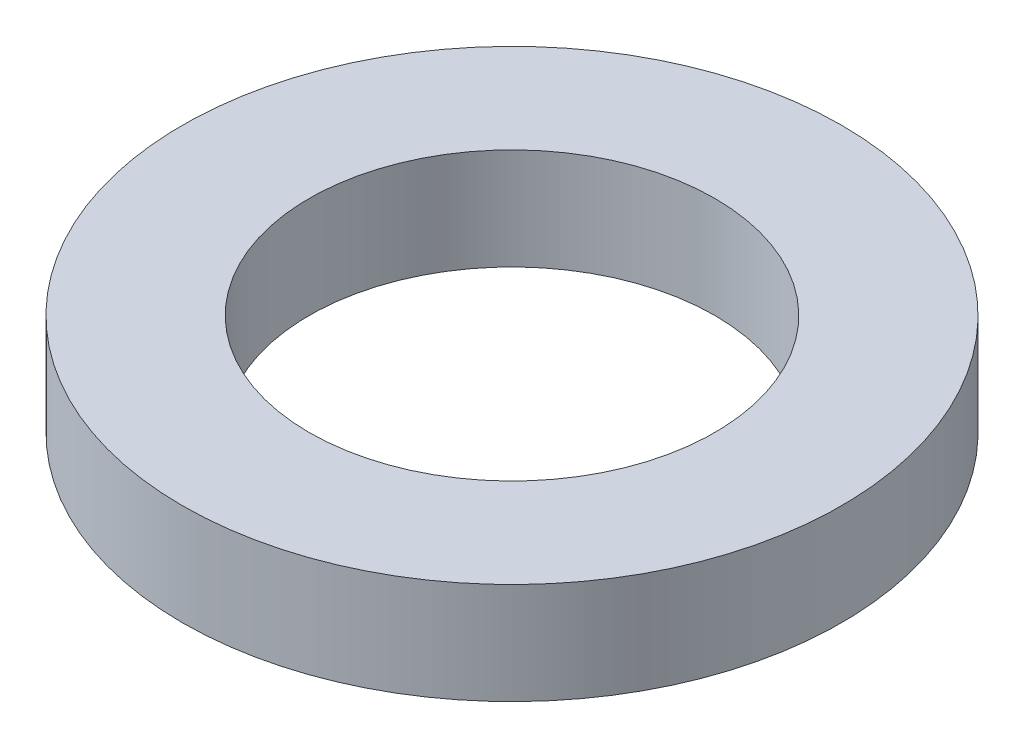
ISO-10303-21;
HEADER;
FILE_DESCRIPTION(('STEP AP214'),'2;1');
FILE_NAME('part.step','',(''),(''),'','','');
FILE_SCHEMA(('AUTOMOTIVE_DESIGN { 1 0 10303 214 1 1 1 1 }'));
ENDSEC;
DATA;
#1=APPLICATION_CONTEXT('core data for automotive mechanical design processes');
#2=APPLICATION_PROTOCOL_DEFINITION('international standard','automotive_design',2000,#1);
#3=PRODUCT_CONTEXT('',#1,'mechanical');
#4=PRODUCT('Part','Part','',(#3));
#5=PRODUCT_RELATED_PRODUCT_CATEGORY('part','',(#4));
#6=PRODUCT_DEFINITION_FORMATION('','',#4);
#7=PRODUCT_DEFINITION_CONTEXT('part definition',#1,'design');
#8=PRODUCT_DEFINITION('design','',#6,#7);
#9=PRODUCT_DEFINITION_SHAPE('','',#8);
#10=(LENGTH_UNIT() NAMED_UNIT(*) SI_UNIT(.MILLI.,.METRE.));
#11=(NAMED_UNIT(*) PLANE_ANGLE_UNIT() SI_UNIT($,.RADIAN.));
#12=(NAMED_UNIT(*) SI_UNIT($,.STERADIAN.) SOLID_ANGLE_UNIT());
#13=UNCERTAINTY_MEASURE_WITH_UNIT(LENGTH_MEASURE(1.E-05),#10,'distance_accuracy_value','');
#14=(GEOMETRIC_REPRESENTATION_CONTEXT(3) GLOBAL_UNCERTAINTY_ASSIGNED_CONTEXT((#13)) GLOBAL_UNIT_ASSIGNED_CONTEXT((#10,
#11,#12)) REPRESENTATION_CONTEXT('',''));
#15=CARTESIAN_POINT('',(0.,0.,0.));
#16=DIRECTION('',(0.,0.,1.));
#17=DIRECTION('',(1.,0.,0.));
#18=AXIS2_PLACEMENT_3D('',#15,#16,#17);
#19=CARTESIAN_POINT('',(0.,2.,0.));
#20=DIRECTION('',(0.,1.,0.));
#21=DIRECTION('',(0.,0.,1.));
#22=AXIS2_PLACEMENT_3D('',#19,#20,#21);
#23=PLANE('',#22);
#24=CARTESIAN_POINT('',(0.,2.,0.));
#25=DIRECTION('',(0.,1.,0.));
#26=DIRECTION('',(0.,0.,1.));
#27=AXIS2_PLACEMENT_3D('',#24,#25,#26);
#28=CIRCLE('',#27,6.5);
#29=CARTESIAN_POINT('',(0.,2.,6.5));
#30=VERTEX_POINT('',#29);
#31=EDGE_CURVE('E10',#30,#30,#28,.T.);
#32=ORIENTED_EDGE('',*,*,#31,.T.);
#33=EDGE_LOOP('',(#32));
#34=FACE_BOUND('',#33,.T.);
#35=CARTESIAN_POINT('',(0.,2.,0.));
#36=DIRECTION('',(0.,1.,0.));
#37=DIRECTION('',(0.,0.,1.));
#38=AXIS2_PLACEMENT_3D('',#35,#36,#37);
#39=CIRCLE('',#38,4.);
#40=CARTESIAN_POINT('',(0.,2.,4.));
#41=VERTEX_POINT('',#40);
#42=EDGE_CURVE('E50',#41,#41,#39,.T.);
#43=ORIENTED_EDGE('',*,*,#42,.F.);
#44=EDGE_LOOP('',(#43));
#45=FACE_BOUND('',#44,.T.);
#46=ADVANCED_FACE('F37',(#34,#45),#23,.T.);
#47=CARTESIAN_POINT('',(0.,0.,0.));
#48=DIRECTION('',(0.,1.,0.));
#49=DIRECTION('',(0.,0.,1.));
#50=AXIS2_PLACEMENT_3D('',#47,#48,#49);
#51=PLANE('',#50);
#52=CARTESIAN_POINT('',(0.,0.,0.));
#53=DIRECTION('',(0.,1.,0.));
#54=DIRECTION('',(0.,0.,1.));
#55=AXIS2_PLACEMENT_3D('',#52,#53,#54);
#56=CIRCLE('',#55,6.5);
#57=CARTESIAN_POINT('',(0.,0.,6.5));
#58=VERTEX_POINT('',#57);
#59=EDGE_CURVE('E41',#58,#58,#56,.T.);
#60=ORIENTED_EDGE('',*,*,#59,.F.);
#61=EDGE_LOOP('',(#60));
#62=FACE_BOUND('',#61,.T.);
#63=CARTESIAN_POINT('',(0.,0.,0.));
#64=DIRECTION('',(0.,1.,0.));
#65=DIRECTION('',(0.,0.,1.));
#66=AXIS2_PLACEMENT_3D('',#63,#64,#65);
#67=CIRCLE('',#66,4.);
#68=CARTESIAN_POINT('',(0.,0.,4.));
#69=VERTEX_POINT('',#68);
#70=EDGE_CURVE('E52',#69,#69,#67,.T.);
#71=ORIENTED_EDGE('',*,*,#70,.T.);
#72=EDGE_LOOP('',(#71));
#73=FACE_BOUND('',#72,.T.);
#74=ADVANCED_FACE('F64',(#62,#73),#51,.F.);
#75=CARTESIAN_POINT('',(0.,2.,0.));
#76=DIRECTION('',(0.,-1.,0.));
#77=DIRECTION('',(0.,0.,-1.));
#78=AXIS2_PLACEMENT_3D('',#75,#76,#77);
#79=CYLINDRICAL_SURFACE('',#78,6.5);
#80=ORIENTED_EDGE('',*,*,#31,.F.);
#81=EDGE_LOOP('',(#80));
#82=FACE_BOUND('',#81,.T.);
#83=ORIENTED_EDGE('',*,*,#59,.T.);
#84=EDGE_LOOP('',(#83));
#85=FACE_BOUND('',#84,.T.);
#86=ADVANCED_FACE('F39',(#82,#85),#79,.T.);
#87=CARTESIAN_POINT('',(0.,2.,0.));
#88=DIRECTION('',(0.,-1.,0.));
#89=DIRECTION('',(0.,0.,-1.));
#90=AXIS2_PLACEMENT_3D('',#87,#88,#89);
#91=CYLINDRICAL_SURFACE('',#90,4.);
#92=ORIENTED_EDGE('',*,*,#42,.T.);
#93=EDGE_LOOP('',(#92));
#94=FACE_BOUND('',#93,.T.);
#95=ORIENTED_EDGE('',*,*,#70,.F.);
#96=EDGE_LOOP('',(#95));
#97=FACE_BOUND('',#96,.T.);
#98=ADVANCED_FACE('F60',(#94,#97),#91,.F.);
#99=CLOSED_SHELL('',(#46,#74,#86,#98));
#100=MANIFOLD_SOLID_BREP('B2',#99);
#101=ADVANCED_BREP_SHAPE_REPRESENTATION('',(#18,#100),#14);
#102=SHAPE_DEFINITION_REPRESENTATION(#9,#101);
ENDSEC;
END-ISO-10303-21;
